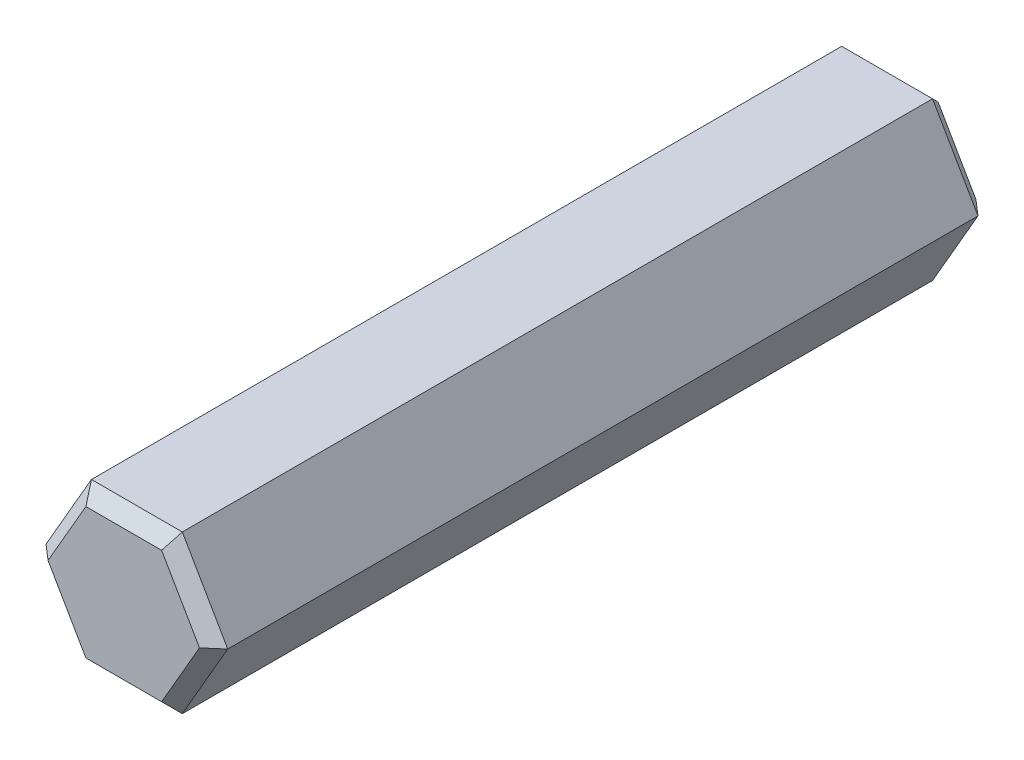
ISO-10303-21;
HEADER;
FILE_DESCRIPTION(('STEP AP214'),'2;1');
FILE_NAME('part.step','',(''),(''),'','','');
FILE_SCHEMA(('AUTOMOTIVE_DESIGN { 1 0 10303 214 1 1 1 1 }'));
ENDSEC;
DATA;
#1=APPLICATION_CONTEXT('core data for automotive mechanical design processes');
#2=APPLICATION_PROTOCOL_DEFINITION('international standard','automotive_design',2000,#1);
#3=PRODUCT_CONTEXT('',#1,'mechanical');
#4=PRODUCT('Part','Part','',(#3));
#5=PRODUCT_RELATED_PRODUCT_CATEGORY('part','',(#4));
#6=PRODUCT_DEFINITION_FORMATION('','',#4);
#7=PRODUCT_DEFINITION_CONTEXT('part definition',#1,'design');
#8=PRODUCT_DEFINITION('design','',#6,#7);
#9=PRODUCT_DEFINITION_SHAPE('','',#8);
#10=(LENGTH_UNIT() NAMED_UNIT(*) SI_UNIT(.MILLI.,.METRE.));
#11=(NAMED_UNIT(*) PLANE_ANGLE_UNIT() SI_UNIT($,.RADIAN.));
#12=(NAMED_UNIT(*) SI_UNIT($,.STERADIAN.) SOLID_ANGLE_UNIT());
#13=UNCERTAINTY_MEASURE_WITH_UNIT(LENGTH_MEASURE(1.E-05),#10,'distance_accuracy_value','');
#14=(GEOMETRIC_REPRESENTATION_CONTEXT(3) GLOBAL_UNCERTAINTY_ASSIGNED_CONTEXT((#13)) GLOBAL_UNIT_ASSIGNED_CONTEXT((#10,
#11,#12)) REPRESENTATION_CONTEXT('',''));
#15=CARTESIAN_POINT('',(0.,0.,0.));
#16=DIRECTION('',(0.,0.,1.));
#17=DIRECTION('',(1.,0.,0.));
#18=AXIS2_PLACEMENT_3D('',#15,#16,#17);
#19=CARTESIAN_POINT('',(1.37481532850779,-4.365625,0.396875));
#20=DIRECTION('',(0.,-0.707106781186548,-0.707106781186547));
#21=DIRECTION('',(0.,0.707106781186547,-0.707106781186548));
#22=AXIS2_PLACEMENT_3D('',#19,#20,#21);
#23=PLANE('',#22);
#24=DIRECTION('',(1.,0.,0.));
#25=VECTOR('',#24,1.);
#26=CARTESIAN_POINT('',(0.,-3.96875,0.));
#27=LINE('',#26,#25);
#28=CARTESIAN_POINT('',(-2.29135888084633,-3.96875,0.));
#29=VERTEX_POINT('',#28);
#30=CARTESIAN_POINT('',(2.29135888084633,-3.96875,0.));
#31=VERTEX_POINT('',#30);
#32=EDGE_CURVE('E104',#29,#31,#27,.T.);
#33=ORIENTED_EDGE('',*,*,#32,.T.);
#34=DIRECTION('',(-0.377964473009229,0.654653670707976,-0.654653670707978));
#35=VECTOR('',#34,1.);
#36=CARTESIAN_POINT('',(2.74963065701559,-4.7625,0.793750000000005));
#37=LINE('',#36,#35);
#38=CARTESIAN_POINT('',(2.7496306570156,-4.7625,0.793750000000001));
#39=VERTEX_POINT('',#38);
#40=EDGE_CURVE('E137',#39,#31,#37,.T.);
#41=ORIENTED_EDGE('',*,*,#40,.F.);
#42=DIRECTION('',(1.,0.,0.));
#43=VECTOR('',#42,1.);
#44=CARTESIAN_POINT('',(2.7496306570156,-4.7625,0.79375));
#45=LINE('',#44,#43);
#46=CARTESIAN_POINT('',(-2.7496306570156,-4.7625,0.79375));
#47=VERTEX_POINT('',#46);
#48=EDGE_CURVE('E109',#47,#39,#45,.T.);
#49=ORIENTED_EDGE('',*,*,#48,.F.);
#50=DIRECTION('',(-0.377964473009229,-0.654653670707975,0.654653670707978));
#51=VECTOR('',#50,1.);
#52=CARTESIAN_POINT('',(-2.29135888084633,-3.96875,0.));
#53=LINE('',#52,#51);
#54=EDGE_CURVE('E20',#29,#47,#53,.T.);
#55=ORIENTED_EDGE('',*,*,#54,.F.);
#56=EDGE_LOOP('',(#33,#41,#49,#55));
#57=FACE_BOUND('',#56,.T.);
#58=ADVANCED_FACE('F17',(#57),#23,.T.);
#59=CARTESIAN_POINT('',(-3.09333448914255,-3.3734375,0.396875));
#60=DIRECTION('',(-0.612372435695794,-0.353553390593274,-0.707106781186548));
#61=DIRECTION('',(-0.755928946018455,0.,0.654653670707977));
#62=AXIS2_PLACEMENT_3D('',#59,#60,#61);
#63=PLANE('',#62);
#64=DIRECTION('',(0.5,-0.866025403784438,0.));
#65=VECTOR('',#64,1.);
#66=CARTESIAN_POINT('',(-4.58271776169265,0.,0.));
#67=LINE('',#66,#65);
#68=CARTESIAN_POINT('',(-4.58271776169266,0.,0.));
#69=VERTEX_POINT('',#68);
#70=EDGE_CURVE('E114',#69,#29,#67,.T.);
#71=ORIENTED_EDGE('',*,*,#70,.T.);
#72=ORIENTED_EDGE('',*,*,#54,.T.);
#73=DIRECTION('',(0.5,-0.866025403784439,0.));
#74=VECTOR('',#73,1.);
#75=CARTESIAN_POINT('',(-2.7496306570156,-4.7625,0.793750000000001));
#76=LINE('',#75,#74);
#77=CARTESIAN_POINT('',(-5.49926131403119,0.,0.793750000000001));
#78=VERTEX_POINT('',#77);
#79=EDGE_CURVE('E166',#78,#47,#76,.T.);
#80=ORIENTED_EDGE('',*,*,#79,.F.);
#81=DIRECTION('',(-0.755928946018454,0.,0.654653670707977));
#82=VECTOR('',#81,1.);
#83=CARTESIAN_POINT('',(-4.71365255488387,0.,0.113392857142857));
#84=LINE('',#83,#82);
#85=EDGE_CURVE('E117',#69,#78,#84,.T.);
#86=ORIENTED_EDGE('',*,*,#85,.F.);
#87=EDGE_LOOP('',(#71,#72,#80,#86));
#88=FACE_BOUND('',#87,.T.);
#89=ADVANCED_FACE('F115',(#88),#63,.T.);
#90=CARTESIAN_POINT('',(-3.09333448914255,-3.3734375,46.593125));
#91=DIRECTION('',(-0.612372435695793,-0.353553390593273,0.707106781186549));
#92=DIRECTION('',(0.755928946018456,0.,0.654653670707976));
#93=AXIS2_PLACEMENT_3D('',#90,#91,#92);
#94=PLANE('',#93);
#95=DIRECTION('',(0.5,-0.866025403784439,0.));
#96=VECTOR('',#95,1.);
#97=CARTESIAN_POINT('',(-2.7496306570156,-4.7625,46.19625));
#98=LINE('',#97,#96);
#99=CARTESIAN_POINT('',(-2.7496306570156,-4.7625,46.19625));
#100=VERTEX_POINT('',#99);
#101=CARTESIAN_POINT('',(-5.49926131403119,0.,46.19625));
#102=VERTEX_POINT('',#101);
#103=EDGE_CURVE('E156',#100,#102,#98,.F.);
#104=ORIENTED_EDGE('',*,*,#103,.F.);
#105=DIRECTION('',(-0.377964473009235,-0.654653670707976,-0.654653670707974));
#106=VECTOR('',#105,1.);
#107=CARTESIAN_POINT('',(-2.29135888084633,-3.96875,46.99));
#108=LINE('',#107,#106);
#109=CARTESIAN_POINT('',(-2.29135888084633,-3.96875,46.99));
#110=VERTEX_POINT('',#109);
#111=EDGE_CURVE('E112',#110,#100,#108,.T.);
#112=ORIENTED_EDGE('',*,*,#111,.F.);
#113=DIRECTION('',(0.5,-0.866025403784438,0.));
#114=VECTOR('',#113,1.);
#115=CARTESIAN_POINT('',(-4.58271776169265,0.,46.99));
#116=LINE('',#115,#114);
#117=CARTESIAN_POINT('',(-4.58271776169266,0.,46.99));
#118=VERTEX_POINT('',#117);
#119=EDGE_CURVE('E215',#118,#110,#116,.T.);
#120=ORIENTED_EDGE('',*,*,#119,.F.);
#121=DIRECTION('',(0.755928946018455,0.,0.654653670707976));
#122=VECTOR('',#121,1.);
#123=CARTESIAN_POINT('',(-4.71365255488387,0.,46.8766071428572));
#124=LINE('',#123,#122);
#125=EDGE_CURVE('E159',#102,#118,#124,.T.);
#126=ORIENTED_EDGE('',*,*,#125,.F.);
#127=EDGE_LOOP('',(#104,#112,#120,#126));
#128=FACE_BOUND('',#127,.T.);
#129=ADVANCED_FACE('F157',(#128),#94,.T.);
#130=CARTESIAN_POINT('',(1.37481532850779,-4.365625,46.593125));
#131=DIRECTION('',(0.,-0.707106781186546,0.707106781186549));
#132=DIRECTION('',(0.,-0.707106781186549,-0.707106781186546));
#133=AXIS2_PLACEMENT_3D('',#130,#131,#132);
#134=PLANE('',#133);
#135=DIRECTION('',(1.,0.,0.));
#136=VECTOR('',#135,1.);
#137=CARTESIAN_POINT('',(2.7496306570156,-4.7625,46.19625));
#138=LINE('',#137,#136);
#139=CARTESIAN_POINT('',(2.7496306570156,-4.76249999999999,46.19625));
#140=VERTEX_POINT('',#139);
#141=EDGE_CURVE('E120',#140,#100,#138,.F.);
#142=ORIENTED_EDGE('',*,*,#141,.F.);
#143=DIRECTION('',(0.377964473009226,-0.65465367070798,-0.654653670707975));
#144=VECTOR('',#143,1.);
#145=CARTESIAN_POINT('',(2.29135888084633,-3.96875,46.99));
#146=LINE('',#145,#144);
#147=CARTESIAN_POINT('',(2.29135888084633,-3.96875,46.99));
#148=VERTEX_POINT('',#147);
#149=EDGE_CURVE('E134',#148,#140,#146,.T.);
#150=ORIENTED_EDGE('',*,*,#149,.F.);
#151=DIRECTION('',(1.,0.,0.));
#152=VECTOR('',#151,1.);
#153=CARTESIAN_POINT('',(0.,-3.96875,46.99));
#154=LINE('',#153,#152);
#155=EDGE_CURVE('E142',#110,#148,#154,.T.);
#156=ORIENTED_EDGE('',*,*,#155,.F.);
#157=ORIENTED_EDGE('',*,*,#111,.T.);
#158=EDGE_LOOP('',(#142,#150,#156,#157));
#159=FACE_BOUND('',#158,.T.);
#160=ADVANCED_FACE('F140',(#159),#134,.T.);
#161=CARTESIAN_POINT('',(4.46814981765034,-0.9921875,0.396875));
#162=DIRECTION('',(0.612372435695794,-0.353553390593274,-0.707106781186548));
#163=DIRECTION('',(-0.755928946018455,0.,-0.654653670707977));
#164=AXIS2_PLACEMENT_3D('',#161,#162,#163);
#165=PLANE('',#164);
#166=DIRECTION('',(0.5,0.866025403784438,0.));
#167=VECTOR('',#166,1.);
#168=CARTESIAN_POINT('',(2.29135888084633,-3.96875,0.));
#169=LINE('',#168,#167);
#170=CARTESIAN_POINT('',(4.58271776169265,0.,0.));
#171=VERTEX_POINT('',#170);
#172=EDGE_CURVE('E125',#31,#171,#169,.T.);
#173=ORIENTED_EDGE('',*,*,#172,.T.);
#174=DIRECTION('',(-0.755928946018455,0.,-0.654653670707977));
#175=VECTOR('',#174,1.);
#176=CARTESIAN_POINT('',(3.92804379573655,0.,-0.566964285714289));
#177=LINE('',#176,#175);
#178=CARTESIAN_POINT('',(5.49926131403119,0.,0.793750000000005));
#179=VERTEX_POINT('',#178);
#180=EDGE_CURVE('E207',#179,#171,#177,.T.);
#181=ORIENTED_EDGE('',*,*,#180,.F.);
#182=DIRECTION('',(0.5,0.866025403784439,0.));
#183=VECTOR('',#182,1.);
#184=CARTESIAN_POINT('',(5.49926131403119,0.,0.793750000000001));
#185=LINE('',#184,#183);
#186=EDGE_CURVE('E198',#39,#179,#185,.T.);
#187=ORIENTED_EDGE('',*,*,#186,.F.);
#188=ORIENTED_EDGE('',*,*,#40,.T.);
#189=EDGE_LOOP('',(#173,#181,#187,#188));
#190=FACE_BOUND('',#189,.T.);
#191=ADVANCED_FACE('F362',(#190),#165,.T.);
#192=CARTESIAN_POINT('',(4.46814981765034,-0.9921875,46.593125));
#193=DIRECTION('',(0.612372435695793,-0.353553390593273,0.707106781186549));
#194=DIRECTION('',(0.755928946018456,0.,-0.654653670707976));
#195=AXIS2_PLACEMENT_3D('',#192,#193,#194);
#196=PLANE('',#195);
#197=DIRECTION('',(0.5,0.866025403784439,0.));
#198=VECTOR('',#197,1.);
#199=CARTESIAN_POINT('',(5.49926131403119,0.,46.19625));
#200=LINE('',#199,#198);
#201=CARTESIAN_POINT('',(5.49926131403118,0.,46.19625));
#202=VERTEX_POINT('',#201);
#203=EDGE_CURVE('E193',#202,#140,#200,.F.);
#204=ORIENTED_EDGE('',*,*,#203,.F.);
#205=DIRECTION('',(0.755928946018456,0.,-0.654653670707976));
#206=VECTOR('',#205,1.);
#207=CARTESIAN_POINT('',(3.92804379573654,0.,47.5569642857143));
#208=LINE('',#207,#206);
#209=CARTESIAN_POINT('',(4.58271776169265,0.,46.99));
#210=VERTEX_POINT('',#209);
#211=EDGE_CURVE('E201',#210,#202,#208,.T.);
#212=ORIENTED_EDGE('',*,*,#211,.F.);
#213=DIRECTION('',(0.5,0.866025403784438,0.));
#214=VECTOR('',#213,1.);
#215=CARTESIAN_POINT('',(2.29135888084633,-3.96875,46.99));
#216=LINE('',#215,#214);
#217=EDGE_CURVE('E212',#148,#210,#216,.T.);
#218=ORIENTED_EDGE('',*,*,#217,.F.);
#219=ORIENTED_EDGE('',*,*,#149,.T.);
#220=EDGE_LOOP('',(#204,#212,#218,#219));
#221=FACE_BOUND('',#220,.T.);
#222=ADVANCED_FACE('F355',(#221),#196,.T.);
#223=CARTESIAN_POINT('',(2.7496306570156,-4.7625,0.));
#224=DIRECTION('',(0.,-1.,0.));
#225=DIRECTION('',(0.,0.,-1.));
#226=AXIS2_PLACEMENT_3D('',#223,#224,#225);
#227=PLANE('',#226);
#228=ORIENTED_EDGE('',*,*,#141,.T.);
#229=DIRECTION('',(0.,0.,1.));
#230=VECTOR('',#229,1.);
#231=CARTESIAN_POINT('',(-2.7496306570156,-4.7625,0.));
#232=LINE('',#231,#230);
#233=EDGE_CURVE('E150',#47,#100,#232,.T.);
#234=ORIENTED_EDGE('',*,*,#233,.F.);
#235=ORIENTED_EDGE('',*,*,#48,.T.);
#236=DIRECTION('',(0.,0.,1.));
#237=VECTOR('',#236,1.);
#238=CARTESIAN_POINT('',(2.7496306570156,-4.7625,0.));
#239=LINE('',#238,#237);
#240=EDGE_CURVE('E153',#140,#39,#239,.F.);
#241=ORIENTED_EDGE('',*,*,#240,.F.);
#242=EDGE_LOOP('',(#228,#234,#235,#241));
#243=FACE_BOUND('',#242,.T.);
#244=ADVANCED_FACE('F148',(#243),#227,.T.);
#245=CARTESIAN_POINT('',(0.,0.,0.));
#246=DIRECTION('',(0.,0.,1.));
#247=DIRECTION('',(1.,0.,0.));
#248=AXIS2_PLACEMENT_3D('',#245,#246,#247);
#249=PLANE('',#248);
#250=DIRECTION('',(-0.5,0.866025403784439,0.));
#251=VECTOR('',#250,1.);
#252=CARTESIAN_POINT('',(4.58271776169265,0.,0.));
#253=LINE('',#252,#251);
#254=CARTESIAN_POINT('',(2.29135888084632,3.96875,0.));
#255=VERTEX_POINT('',#254);
#256=EDGE_CURVE('E180',#171,#255,#253,.T.);
#257=ORIENTED_EDGE('',*,*,#256,.F.);
#258=ORIENTED_EDGE('',*,*,#172,.F.);
#259=ORIENTED_EDGE('',*,*,#32,.F.);
#260=ORIENTED_EDGE('',*,*,#70,.F.);
#261=DIRECTION('',(-0.5,-0.866025403784439,0.));
#262=VECTOR('',#261,1.);
#263=CARTESIAN_POINT('',(-2.29135888084633,3.96875,0.));
#264=LINE('',#263,#262);
#265=CARTESIAN_POINT('',(-2.29135888084633,3.96875,0.));
#266=VERTEX_POINT('',#265);
#267=EDGE_CURVE('E127',#266,#69,#264,.T.);
#268=ORIENTED_EDGE('',*,*,#267,.F.);
#269=DIRECTION('',(1.,0.,0.));
#270=VECTOR('',#269,1.);
#271=CARTESIAN_POINT('',(-1.37481532850781,3.96875,0.));
#272=LINE('',#271,#270);
#273=EDGE_CURVE('E178',#255,#266,#272,.F.);
#274=ORIENTED_EDGE('',*,*,#273,.F.);
#275=EDGE_LOOP('',(#257,#258,#259,#260,#268,#274));
#276=FACE_BOUND('',#275,.T.);
#277=ADVANCED_FACE('F124',(#276),#249,.F.);
#278=CARTESIAN_POINT('',(-4.46814981765034,0.9921875,0.396875));
#279=DIRECTION('',(-0.612372435695795,0.353553390593274,-0.707106781186548));
#280=DIRECTION('',(-0.755928946018454,0.,0.654653670707977));
#281=AXIS2_PLACEMENT_3D('',#278,#279,#280);
#282=PLANE('',#281);
#283=ORIENTED_EDGE('',*,*,#267,.T.);
#284=ORIENTED_EDGE('',*,*,#85,.T.);
#285=DIRECTION('',(-0.5,-0.866025403784439,0.));
#286=VECTOR('',#285,1.);
#287=CARTESIAN_POINT('',(-5.49926131403119,0.,0.793750000000001));
#288=LINE('',#287,#286);
#289=CARTESIAN_POINT('',(-2.7496306570156,4.7625,0.793750000000002));
#290=VERTEX_POINT('',#289);
#291=EDGE_CURVE('E255',#290,#78,#288,.T.);
#292=ORIENTED_EDGE('',*,*,#291,.F.);
#293=DIRECTION('',(-0.37796447300923,0.654653670707976,0.654653670707977));
#294=VECTOR('',#293,1.);
#295=CARTESIAN_POINT('',(-2.29135888084633,3.96875,0.));
#296=LINE('',#295,#294);
#297=EDGE_CURVE('E175',#266,#290,#296,.T.);
#298=ORIENTED_EDGE('',*,*,#297,.F.);
#299=EDGE_LOOP('',(#283,#284,#292,#298));
#300=FACE_BOUND('',#299,.T.);
#301=ADVANCED_FACE('F173',(#300),#282,.T.);
#302=CARTESIAN_POINT('',(-2.7496306570156,-4.7625,0.));
#303=DIRECTION('',(-0.866025403784439,-0.5,0.));
#304=DIRECTION('',(0.5,-0.866025403784439,0.));
#305=AXIS2_PLACEMENT_3D('',#302,#303,#304);
#306=PLANE('',#305);
#307=ORIENTED_EDGE('',*,*,#103,.T.);
#308=DIRECTION('',(0.,0.,1.));
#309=VECTOR('',#308,1.);
#310=CARTESIAN_POINT('',(-5.49926131403119,0.,0.));
#311=LINE('',#310,#309);
#312=EDGE_CURVE('E233',#78,#102,#311,.T.);
#313=ORIENTED_EDGE('',*,*,#312,.F.);
#314=ORIENTED_EDGE('',*,*,#79,.T.);
#315=ORIENTED_EDGE('',*,*,#233,.T.);
#316=EDGE_LOOP('',(#307,#313,#314,#315));
#317=FACE_BOUND('',#316,.T.);
#318=ADVANCED_FACE('F165',(#317),#306,.T.);
#319=CARTESIAN_POINT('',(-4.46814981765034,0.9921875,46.593125));
#320=DIRECTION('',(-0.612372435695794,0.353553390593273,0.707106781186549));
#321=DIRECTION('',(0.755928946018455,0.,0.654653670707976));
#322=AXIS2_PLACEMENT_3D('',#319,#320,#321);
#323=PLANE('',#322);
#324=DIRECTION('',(-0.5,-0.866025403784439,0.));
#325=VECTOR('',#324,1.);
#326=CARTESIAN_POINT('',(-5.49926131403119,0.,46.19625));
#327=LINE('',#326,#325);
#328=CARTESIAN_POINT('',(-2.74963065701559,4.7625,46.19625));
#329=VERTEX_POINT('',#328);
#330=EDGE_CURVE('E221',#102,#329,#327,.F.);
#331=ORIENTED_EDGE('',*,*,#330,.F.);
#332=ORIENTED_EDGE('',*,*,#125,.T.);
#333=DIRECTION('',(-0.5,-0.866025403784439,0.));
#334=VECTOR('',#333,1.);
#335=CARTESIAN_POINT('',(-2.29135888084633,3.96875,46.99));
#336=LINE('',#335,#334);
#337=CARTESIAN_POINT('',(-2.29135888084633,3.96875,46.99));
#338=VERTEX_POINT('',#337);
#339=EDGE_CURVE('E209',#338,#118,#336,.T.);
#340=ORIENTED_EDGE('',*,*,#339,.F.);
#341=DIRECTION('',(-0.377964473009226,0.65465367070798,-0.654653670707975));
#342=VECTOR('',#341,1.);
#343=CARTESIAN_POINT('',(-2.29135888084633,3.96875,46.99));
#344=LINE('',#343,#342);
#345=EDGE_CURVE('E163',#338,#329,#344,.T.);
#346=ORIENTED_EDGE('',*,*,#345,.T.);
#347=EDGE_LOOP('',(#331,#332,#340,#346));
#348=FACE_BOUND('',#347,.T.);
#349=ADVANCED_FACE('F220',(#348),#323,.T.);
#350=CARTESIAN_POINT('',(0.,0.,46.99));
#351=DIRECTION('',(0.,0.,1.));
#352=DIRECTION('',(1.,0.,0.));
#353=AXIS2_PLACEMENT_3D('',#350,#351,#352);
#354=PLANE('',#353);
#355=DIRECTION('',(1.,0.,0.));
#356=VECTOR('',#355,1.);
#357=CARTESIAN_POINT('',(-1.37481532850781,3.96875,46.99));
#358=LINE('',#357,#356);
#359=CARTESIAN_POINT('',(2.29135888084633,3.96875,46.99));
#360=VERTEX_POINT('',#359);
#361=EDGE_CURVE('E234',#338,#360,#358,.T.);
#362=ORIENTED_EDGE('',*,*,#361,.F.);
#363=ORIENTED_EDGE('',*,*,#339,.T.);
#364=ORIENTED_EDGE('',*,*,#119,.T.);
#365=ORIENTED_EDGE('',*,*,#155,.T.);
#366=ORIENTED_EDGE('',*,*,#217,.T.);
#367=DIRECTION('',(0.5,-0.866025403784439,0.));
#368=VECTOR('',#367,1.);
#369=CARTESIAN_POINT('',(2.29135888084632,3.96875,46.99));
#370=LINE('',#369,#368);
#371=EDGE_CURVE('E203',#360,#210,#370,.T.);
#372=ORIENTED_EDGE('',*,*,#371,.F.);
#373=EDGE_LOOP('',(#362,#363,#364,#365,#366,#372));
#374=FACE_BOUND('',#373,.T.);
#375=ADVANCED_FACE('F257',(#374),#354,.T.);
#376=CARTESIAN_POINT('',(3.09333448914252,3.3734375,0.396875));
#377=DIRECTION('',(0.612372435695794,0.353553390593274,-0.707106781186548));
#378=DIRECTION('',(-0.755928946018455,0.,-0.654653670707977));
#379=AXIS2_PLACEMENT_3D('',#376,#377,#378);
#380=PLANE('',#379);
#381=ORIENTED_EDGE('',*,*,#256,.T.);
#382=DIRECTION('',(-0.377964473009231,-0.654653670707976,-0.654653670707977));
#383=VECTOR('',#382,1.);
#384=CARTESIAN_POINT('',(2.7496306570156,4.7625,0.793749999999999));
#385=LINE('',#384,#383);
#386=CARTESIAN_POINT('',(2.74963065701559,4.7625,0.793750000000005));
#387=VERTEX_POINT('',#386);
#388=EDGE_CURVE('E183',#387,#255,#385,.T.);
#389=ORIENTED_EDGE('',*,*,#388,.F.);
#390=DIRECTION('',(-0.5,0.866025403784439,0.));
#391=VECTOR('',#390,1.);
#392=CARTESIAN_POINT('',(2.7496306570156,4.7625,0.793750000000001));
#393=LINE('',#392,#391);
#394=EDGE_CURVE('E250',#179,#387,#393,.T.);
#395=ORIENTED_EDGE('',*,*,#394,.F.);
#396=ORIENTED_EDGE('',*,*,#180,.T.);
#397=EDGE_LOOP('',(#381,#389,#395,#396));
#398=FACE_BOUND('',#397,.T.);
#399=ADVANCED_FACE('F263',(#398),#380,.T.);
#400=CARTESIAN_POINT('',(3.09333448914252,3.3734375,46.593125));
#401=DIRECTION('',(0.612372435695793,0.353553390593273,0.707106781186549));
#402=DIRECTION('',(0.755928946018456,0.,-0.654653670707976));
#403=AXIS2_PLACEMENT_3D('',#400,#401,#402);
#404=PLANE('',#403);
#405=DIRECTION('',(-0.5,0.866025403784439,0.));
#406=VECTOR('',#405,1.);
#407=CARTESIAN_POINT('',(2.7496306570156,4.7625,46.19625));
#408=LINE('',#407,#406);
#409=CARTESIAN_POINT('',(2.74963065701559,4.76249999999999,46.19625));
#410=VERTEX_POINT('',#409);
#411=EDGE_CURVE('E35',#410,#202,#408,.F.);
#412=ORIENTED_EDGE('',*,*,#411,.F.);
#413=DIRECTION('',(0.377964473009237,0.654653670707976,-0.654653670707973));
#414=VECTOR('',#413,1.);
#415=CARTESIAN_POINT('',(2.29135888084633,3.96875,46.99));
#416=LINE('',#415,#414);
#417=EDGE_CURVE('E238',#360,#410,#416,.T.);
#418=ORIENTED_EDGE('',*,*,#417,.F.);
#419=ORIENTED_EDGE('',*,*,#371,.T.);
#420=ORIENTED_EDGE('',*,*,#211,.T.);
#421=EDGE_LOOP('',(#412,#418,#419,#420));
#422=FACE_BOUND('',#421,.T.);
#423=ADVANCED_FACE('F260',(#422),#404,.T.);
#424=CARTESIAN_POINT('',(5.49926131403119,0.,0.));
#425=DIRECTION('',(0.866025403784439,-0.5,0.));
#426=DIRECTION('',(0.5,0.866025403784439,0.));
#427=AXIS2_PLACEMENT_3D('',#424,#425,#426);
#428=PLANE('',#427);
#429=ORIENTED_EDGE('',*,*,#203,.T.);
#430=ORIENTED_EDGE('',*,*,#240,.T.);
#431=ORIENTED_EDGE('',*,*,#186,.T.);
#432=DIRECTION('',(0.,0.,1.));
#433=VECTOR('',#432,1.);
#434=CARTESIAN_POINT('',(5.49926131403119,0.,0.));
#435=LINE('',#434,#433);
#436=EDGE_CURVE('E244',#202,#179,#435,.F.);
#437=ORIENTED_EDGE('',*,*,#436,.F.);
#438=EDGE_LOOP('',(#429,#430,#431,#437));
#439=FACE_BOUND('',#438,.T.);
#440=ADVANCED_FACE('F262',(#439),#428,.T.);
#441=CARTESIAN_POINT('',(-1.37481532850781,4.365625,0.396875));
#442=DIRECTION('',(0.,0.707106781186548,-0.707106781186547));
#443=DIRECTION('',(0.,0.707106781186547,0.707106781186548));
#444=AXIS2_PLACEMENT_3D('',#441,#442,#443);
#445=PLANE('',#444);
#446=ORIENTED_EDGE('',*,*,#273,.T.);
#447=ORIENTED_EDGE('',*,*,#297,.T.);
#448=DIRECTION('',(1.,0.,0.));
#449=VECTOR('',#448,1.);
#450=CARTESIAN_POINT('',(-2.7496306570156,4.7625,0.79375));
#451=LINE('',#450,#449);
#452=EDGE_CURVE('E188',#387,#290,#451,.F.);
#453=ORIENTED_EDGE('',*,*,#452,.F.);
#454=ORIENTED_EDGE('',*,*,#388,.T.);
#455=EDGE_LOOP('',(#446,#447,#453,#454));
#456=FACE_BOUND('',#455,.T.);
#457=ADVANCED_FACE('F186',(#456),#445,.T.);
#458=CARTESIAN_POINT('',(-5.49926131403119,0.,0.));
#459=DIRECTION('',(-0.866025403784439,0.5,0.));
#460=DIRECTION('',(-0.5,-0.866025403784439,0.));
#461=AXIS2_PLACEMENT_3D('',#458,#459,#460);
#462=PLANE('',#461);
#463=ORIENTED_EDGE('',*,*,#330,.T.);
#464=DIRECTION('',(0.,0.,1.));
#465=VECTOR('',#464,1.);
#466=CARTESIAN_POINT('',(-2.7496306570156,4.7625,0.));
#467=LINE('',#466,#465);
#468=EDGE_CURVE('E232',#290,#329,#467,.T.);
#469=ORIENTED_EDGE('',*,*,#468,.F.);
#470=ORIENTED_EDGE('',*,*,#291,.T.);
#471=ORIENTED_EDGE('',*,*,#312,.T.);
#472=EDGE_LOOP('',(#463,#469,#470,#471));
#473=FACE_BOUND('',#472,.T.);
#474=ADVANCED_FACE('F229',(#473),#462,.T.);
#475=CARTESIAN_POINT('',(-1.37481532850781,4.365625,46.593125));
#476=DIRECTION('',(0.,0.707106781186546,0.707106781186549));
#477=DIRECTION('',(0.,-0.707106781186549,0.707106781186546));
#478=AXIS2_PLACEMENT_3D('',#475,#476,#477);
#479=PLANE('',#478);
#480=DIRECTION('',(1.,0.,0.));
#481=VECTOR('',#480,1.);
#482=CARTESIAN_POINT('',(-2.7496306570156,4.7625,46.19625));
#483=LINE('',#482,#481);
#484=EDGE_CURVE('E26',#329,#410,#483,.T.);
#485=ORIENTED_EDGE('',*,*,#484,.F.);
#486=ORIENTED_EDGE('',*,*,#345,.F.);
#487=ORIENTED_EDGE('',*,*,#361,.T.);
#488=ORIENTED_EDGE('',*,*,#417,.T.);
#489=EDGE_LOOP('',(#485,#486,#487,#488));
#490=FACE_BOUND('',#489,.T.);
#491=ADVANCED_FACE('F237',(#490),#479,.T.);
#492=CARTESIAN_POINT('',(2.7496306570156,4.7625,0.));
#493=DIRECTION('',(0.866025403784439,0.5,0.));
#494=DIRECTION('',(-0.5,0.866025403784439,0.));
#495=AXIS2_PLACEMENT_3D('',#492,#493,#494);
#496=PLANE('',#495);
#497=ORIENTED_EDGE('',*,*,#411,.T.);
#498=ORIENTED_EDGE('',*,*,#436,.T.);
#499=ORIENTED_EDGE('',*,*,#394,.T.);
#500=DIRECTION('',(0.,0.,1.));
#501=VECTOR('',#500,1.);
#502=CARTESIAN_POINT('',(2.7496306570156,4.7625,0.));
#503=LINE('',#502,#501);
#504=EDGE_CURVE('E11',#410,#387,#503,.F.);
#505=ORIENTED_EDGE('',*,*,#504,.F.);
#506=EDGE_LOOP('',(#497,#498,#499,#505));
#507=FACE_BOUND('',#506,.T.);
#508=ADVANCED_FACE('F274',(#507),#496,.T.);
#509=CARTESIAN_POINT('',(-2.7496306570156,4.7625,0.));
#510=DIRECTION('',(0.,1.,0.));
#511=DIRECTION('',(0.,0.,1.));
#512=AXIS2_PLACEMENT_3D('',#509,#510,#511);
#513=PLANE('',#512);
#514=ORIENTED_EDGE('',*,*,#484,.T.);
#515=ORIENTED_EDGE('',*,*,#504,.T.);
#516=ORIENTED_EDGE('',*,*,#452,.T.);
#517=ORIENTED_EDGE('',*,*,#468,.T.);
#518=EDGE_LOOP('',(#514,#515,#516,#517));
#519=FACE_BOUND('',#518,.T.);
#520=ADVANCED_FACE('F242',(#519),#513,.T.);
#521=CLOSED_SHELL('',(#58,#89,#129,#160,#191,#222,#244,#277,#301,#318,#349,#375,#399,#423,#440,
#457,#474,#491,#508,#520));
#522=MANIFOLD_SOLID_BREP('B1',#521);
#523=ADVANCED_BREP_SHAPE_REPRESENTATION('',(#18,#522),#14);
#524=SHAPE_DEFINITION_REPRESENTATION(#9,#523);
ENDSEC;
END-ISO-10303-21;
